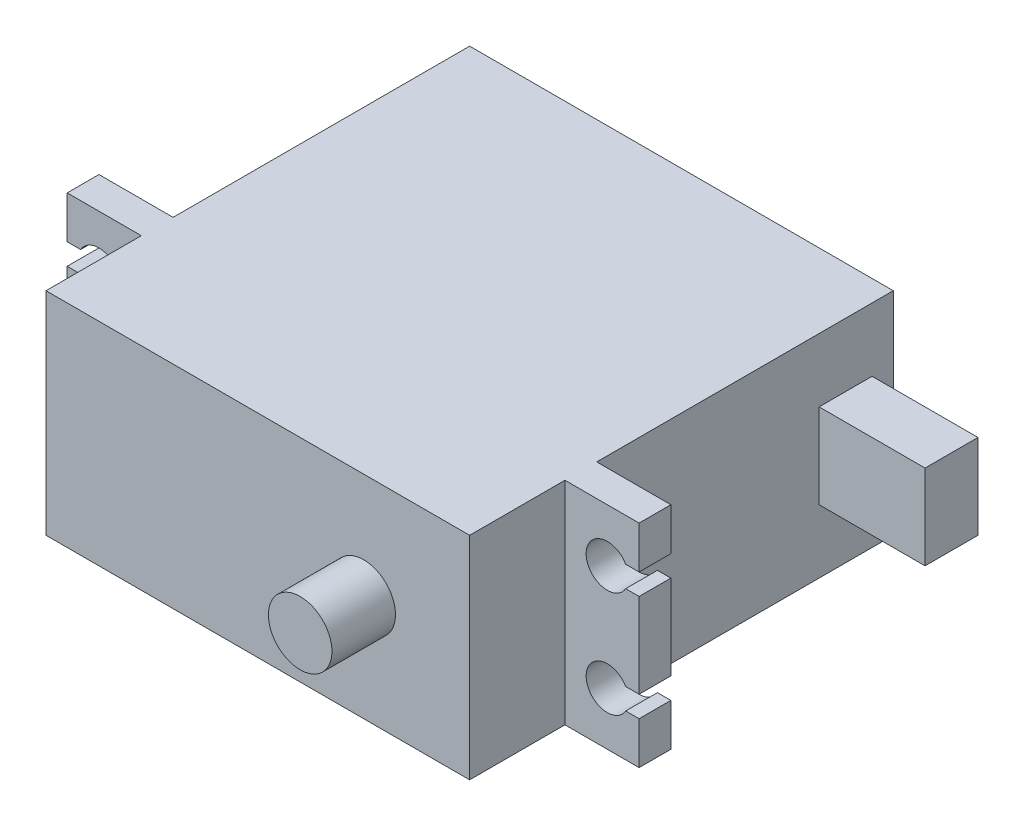
ISO-10303-21;
HEADER;
FILE_DESCRIPTION(('STEP AP214'),'2;1');
FILE_NAME('part.step','',(''),(''),'','','');
FILE_SCHEMA(('AUTOMOTIVE_DESIGN { 1 0 10303 214 1 1 1 1 }'));
ENDSEC;
DATA;
#1=APPLICATION_CONTEXT('core data for automotive mechanical design processes');
#2=APPLICATION_PROTOCOL_DEFINITION('international standard','automotive_design',2000,#1);
#3=PRODUCT_CONTEXT('',#1,'mechanical');
#4=PRODUCT('Part','Part','',(#3));
#5=PRODUCT_RELATED_PRODUCT_CATEGORY('part','',(#4));
#6=PRODUCT_DEFINITION_FORMATION('','',#4);
#7=PRODUCT_DEFINITION_CONTEXT('part definition',#1,'design');
#8=PRODUCT_DEFINITION('design','',#6,#7);
#9=PRODUCT_DEFINITION_SHAPE('','',#8);
#10=(LENGTH_UNIT() NAMED_UNIT(*) SI_UNIT(.MILLI.,.METRE.));
#11=(NAMED_UNIT(*) PLANE_ANGLE_UNIT() SI_UNIT($,.RADIAN.));
#12=(NAMED_UNIT(*) SI_UNIT($,.STERADIAN.) SOLID_ANGLE_UNIT());
#13=UNCERTAINTY_MEASURE_WITH_UNIT(LENGTH_MEASURE(1.E-05),#10,'distance_accuracy_value','');
#14=(GEOMETRIC_REPRESENTATION_CONTEXT(3) GLOBAL_UNCERTAINTY_ASSIGNED_CONTEXT((#13)) GLOBAL_UNIT_ASSIGNED_CONTEXT((#10,
#11,#12)) REPRESENTATION_CONTEXT('',''));
#15=CARTESIAN_POINT('',(0.,0.,0.));
#16=DIRECTION('',(0.,0.,1.));
#17=DIRECTION('',(1.,0.,0.));
#18=AXIS2_PLACEMENT_3D('',#15,#16,#17);
#19=CARTESIAN_POINT('',(10.,-10.,26.));
#20=DIRECTION('',(0.,0.,1.));
#21=DIRECTION('',(1.,0.,0.));
#22=AXIS2_PLACEMENT_3D('',#19,#20,#21);
#23=PLANE('',#22);
#24=CARTESIAN_POINT('',(10.,-10.,26.));
#25=DIRECTION('',(0.,0.,1.));
#26=DIRECTION('',(-1.,0.,0.));
#27=AXIS2_PLACEMENT_3D('',#24,#25,#26);
#28=CIRCLE('',#27,3.);
#29=CARTESIAN_POINT('',(7.,-10.,26.));
#30=VERTEX_POINT('',#29);
#31=EDGE_CURVE('E10',#30,#30,#28,.T.);
#32=ORIENTED_EDGE('',*,*,#31,.T.);
#33=EDGE_LOOP('',(#32));
#34=FACE_BOUND('',#33,.T.);
#35=ADVANCED_FACE('F16',(#34),#23,.T.);
#36=CARTESIAN_POINT('',(10.,-10.,20.));
#37=DIRECTION('',(0.,0.,-1.));
#38=DIRECTION('',(-1.,0.,0.));
#39=AXIS2_PLACEMENT_3D('',#36,#37,#38);
#40=CYLINDRICAL_SURFACE('',#39,3.);
#41=CARTESIAN_POINT('',(10.,-10.,20.));
#42=DIRECTION('',(0.,0.,1.));
#43=DIRECTION('',(-1.,0.,0.));
#44=AXIS2_PLACEMENT_3D('',#41,#42,#43);
#45=CIRCLE('',#44,3.);
#46=CARTESIAN_POINT('',(7.,-10.,20.));
#47=VERTEX_POINT('',#46);
#48=EDGE_CURVE('E494',#47,#47,#45,.T.);
#49=ORIENTED_EDGE('',*,*,#48,.T.);
#50=DIRECTION('',(0.,0.,1.));
#51=VECTOR('',#50,1.);
#52=CARTESIAN_POINT('',(7.,-10.,20.));
#53=LINE('',#52,#51);
#54=EDGE_CURVE('E24',#47,#30,#53,.T.);
#55=ORIENTED_EDGE('',*,*,#54,.T.);
#56=ORIENTED_EDGE('',*,*,#31,.F.);
#57=ORIENTED_EDGE('',*,*,#54,.F.);
#58=EDGE_LOOP('',(#49,#55,#56,#57));
#59=FACE_BOUND('',#58,.T.);
#60=ADVANCED_FACE('F775',(#59),#40,.T.);
#61=CARTESIAN_POINT('',(30.,-10.,-15.5));
#62=DIRECTION('',(1.,0.,0.));
#63=DIRECTION('',(0.,1.,0.));
#64=AXIS2_PLACEMENT_3D('',#61,#62,#63);
#65=PLANE('',#64);
#66=DIRECTION('',(0.,1.,0.));
#67=VECTOR('',#66,1.);
#68=CARTESIAN_POINT('',(30.,-14.,-18.));
#69=LINE('',#68,#67);
#70=CARTESIAN_POINT('',(30.,-14.,-18.));
#71=VERTEX_POINT('',#70);
#72=CARTESIAN_POINT('',(30.,-6.,-18.));
#73=VERTEX_POINT('',#72);
#74=EDGE_CURVE('E350',#71,#73,#69,.T.);
#75=ORIENTED_EDGE('',*,*,#74,.T.);
#76=DIRECTION('',(0.,0.,1.));
#77=VECTOR('',#76,1.);
#78=CARTESIAN_POINT('',(30.,-6.,-18.));
#79=LINE('',#78,#77);
#80=CARTESIAN_POINT('',(30.,-6.,-13.));
#81=VERTEX_POINT('',#80);
#82=EDGE_CURVE('E454',#73,#81,#79,.T.);
#83=ORIENTED_EDGE('',*,*,#82,.T.);
#84=DIRECTION('',(0.,-1.,0.));
#85=VECTOR('',#84,1.);
#86=CARTESIAN_POINT('',(30.,-6.,-13.));
#87=LINE('',#86,#85);
#88=CARTESIAN_POINT('',(30.,-14.,-13.));
#89=VERTEX_POINT('',#88);
#90=EDGE_CURVE('E445',#81,#89,#87,.T.);
#91=ORIENTED_EDGE('',*,*,#90,.T.);
#92=DIRECTION('',(0.,0.,-1.));
#93=VECTOR('',#92,1.);
#94=CARTESIAN_POINT('',(30.,-14.,-13.));
#95=LINE('',#94,#93);
#96=EDGE_CURVE('E265',#89,#71,#95,.T.);
#97=ORIENTED_EDGE('',*,*,#96,.T.);
#98=EDGE_LOOP('',(#75,#83,#91,#97));
#99=FACE_BOUND('',#98,.T.);
#100=ADVANCED_FACE('F776',(#99),#65,.T.);
#101=CARTESIAN_POINT('',(25.732050807624,-16.,81.815334497551));
#102=DIRECTION('',(0.,-1.,0.));
#103=DIRECTION('',(-1.,0.,0.));
#104=AXIS2_PLACEMENT_3D('',#101,#102,#103);
#105=PLANE('',#104);
#106=DIRECTION('',(0.,0.,-1.));
#107=VECTOR('',#106,1.);
#108=CARTESIAN_POINT('',(27.,-16.,81.815334497551));
#109=LINE('',#108,#107);
#110=CARTESIAN_POINT('',(27.,-16.,11.));
#111=VERTEX_POINT('',#110);
#112=CARTESIAN_POINT('',(27.,-16.,8.));
#113=VERTEX_POINT('',#112);
#114=EDGE_CURVE('E229',#111,#113,#109,.T.);
#115=ORIENTED_EDGE('',*,*,#114,.T.);
#116=DIRECTION('',(1.,0.,0.));
#117=VECTOR('',#116,1.);
#118=CARTESIAN_POINT('',(12.866025403812,-16.,8.));
#119=LINE('',#118,#117);
#120=CARTESIAN_POINT('',(25.732050807602,-15.99999999999,8.));
#121=VERTEX_POINT('',#120);
#122=EDGE_CURVE('E397',#121,#113,#119,.T.);
#123=ORIENTED_EDGE('',*,*,#122,.F.);
#124=DIRECTION('',(0.,0.,-1.));
#125=VECTOR('',#124,1.);
#126=CARTESIAN_POINT('',(25.732050807602,-15.99999999999,81.815334497551));
#127=LINE('',#126,#125);
#128=CARTESIAN_POINT('',(25.732050807602,-15.99999999999,11.));
#129=VERTEX_POINT('',#128);
#130=EDGE_CURVE('E379',#129,#121,#127,.T.);
#131=ORIENTED_EDGE('',*,*,#130,.F.);
#132=DIRECTION('',(1.,0.,0.));
#133=VECTOR('',#132,1.);
#134=CARTESIAN_POINT('',(12.866025403812,-16.,11.));
#135=LINE('',#134,#133);
#136=EDGE_CURVE('E510',#129,#111,#135,.T.);
#137=ORIENTED_EDGE('',*,*,#136,.T.);
#138=EDGE_LOOP('',(#115,#123,#131,#137));
#139=FACE_BOUND('',#138,.T.);
#140=ADVANCED_FACE('F525',(#139),#105,.F.);
#141=CARTESIAN_POINT('',(24.,-15.,81.815334497551));
#142=DIRECTION('',(0.,0.,1.));
#143=DIRECTION('',(-1.,0.,0.));
#144=AXIS2_PLACEMENT_3D('',#141,#142,#143);
#145=CYLINDRICAL_SURFACE('',#144,2.);
#146=ORIENTED_EDGE('',*,*,#130,.T.);
#147=CARTESIAN_POINT('',(24.,-15.,8.));
#148=DIRECTION('',(0.,0.,1.));
#149=DIRECTION('',(-1.,0.,0.));
#150=AXIS2_PLACEMENT_3D('',#147,#148,#149);
#151=CIRCLE('',#150,2.);
#152=CARTESIAN_POINT('',(25.732050807606,-14.00000000001,8.));
#153=VERTEX_POINT('',#152);
#154=EDGE_CURVE('E403',#153,#121,#151,.T.);
#155=ORIENTED_EDGE('',*,*,#154,.F.);
#156=DIRECTION('',(0.,0.,-1.));
#157=VECTOR('',#156,1.);
#158=CARTESIAN_POINT('',(25.732050807606,-14.00000000001,81.815334497551));
#159=LINE('',#158,#157);
#160=CARTESIAN_POINT('',(25.732050807606,-14.00000000001,11.));
#161=VERTEX_POINT('',#160);
#162=EDGE_CURVE('E383',#161,#153,#159,.T.);
#163=ORIENTED_EDGE('',*,*,#162,.F.);
#164=CARTESIAN_POINT('',(24.,-15.,11.));
#165=DIRECTION('',(0.,0.,1.));
#166=DIRECTION('',(-1.,0.,0.));
#167=AXIS2_PLACEMENT_3D('',#164,#165,#166);
#168=CIRCLE('',#167,2.);
#169=EDGE_CURVE('E285',#161,#129,#168,.T.);
#170=ORIENTED_EDGE('',*,*,#169,.T.);
#171=EDGE_LOOP('',(#146,#155,#163,#170));
#172=FACE_BOUND('',#171,.T.);
#173=ADVANCED_FACE('F516',(#172),#145,.F.);
#174=CARTESIAN_POINT('',(25.732050807626,-14.,81.815334497551));
#175=DIRECTION('',(8.62156E-12,-1.,0.));
#176=DIRECTION('',(0.,0.,-1.));
#177=AXIS2_PLACEMENT_3D('',#174,#175,#176);
#178=PLANE('',#177);
#179=DIRECTION('',(1.,8.62156E-12,0.));
#180=VECTOR('',#179,1.);
#181=CARTESIAN_POINT('',(12.86602540383,-14.00000000011,11.));
#182=LINE('',#181,#180);
#183=CARTESIAN_POINT('',(27.,-13.99999999999,11.));
#184=VERTEX_POINT('',#183);
#185=EDGE_CURVE('E217',#161,#184,#182,.T.);
#186=ORIENTED_EDGE('',*,*,#185,.F.);
#187=ORIENTED_EDGE('',*,*,#162,.T.);
#188=DIRECTION('',(1.,8.62156E-12,0.));
#189=VECTOR('',#188,1.);
#190=CARTESIAN_POINT('',(12.86602540383,-14.00000000011,8.));
#191=LINE('',#190,#189);
#192=CARTESIAN_POINT('',(27.,-13.99999999999,8.));
#193=VERTEX_POINT('',#192);
#194=EDGE_CURVE('E434',#153,#193,#191,.T.);
#195=ORIENTED_EDGE('',*,*,#194,.T.);
#196=DIRECTION('',(0.,0.,-1.));
#197=VECTOR('',#196,1.);
#198=CARTESIAN_POINT('',(27.,-13.99999999999,81.815334497551));
#199=LINE('',#198,#197);
#200=EDGE_CURVE('E384',#184,#193,#199,.T.);
#201=ORIENTED_EDGE('',*,*,#200,.F.);
#202=EDGE_LOOP('',(#186,#187,#195,#201));
#203=FACE_BOUND('',#202,.T.);
#204=ADVANCED_FACE('F828',(#203),#178,.T.);
#205=CARTESIAN_POINT('',(27.,-20.,8.));
#206=DIRECTION('',(-1.,0.,0.));
#207=DIRECTION('',(0.,0.,1.));
#208=AXIS2_PLACEMENT_3D('',#205,#206,#207);
#209=PLANE('',#208);
#210=DIRECTION('',(0.,0.,-1.));
#211=VECTOR('',#210,1.);
#212=CARTESIAN_POINT('',(27.,-6.000000000005,81.815334497551));
#213=LINE('',#212,#211);
#214=CARTESIAN_POINT('',(27.,-6.000000000005,11.));
#215=VERTEX_POINT('',#214);
#216=CARTESIAN_POINT('',(27.,-6.000000000005,8.));
#217=VERTEX_POINT('',#216);
#218=EDGE_CURVE('E200',#215,#217,#213,.T.);
#219=ORIENTED_EDGE('',*,*,#218,.F.);
#220=DIRECTION('',(0.,1.,0.));
#221=VECTOR('',#220,1.);
#222=CARTESIAN_POINT('',(27.,-20.,11.));
#223=LINE('',#222,#221);
#224=EDGE_CURVE('E213',#184,#215,#223,.T.);
#225=ORIENTED_EDGE('',*,*,#224,.F.);
#226=ORIENTED_EDGE('',*,*,#200,.T.);
#227=DIRECTION('',(0.,1.,0.));
#228=VECTOR('',#227,1.);
#229=CARTESIAN_POINT('',(27.,-20.,8.));
#230=LINE('',#229,#228);
#231=EDGE_CURVE('E431',#193,#217,#230,.T.);
#232=ORIENTED_EDGE('',*,*,#231,.T.);
#233=EDGE_LOOP('',(#219,#225,#226,#232));
#234=FACE_BOUND('',#233,.T.);
#235=ADVANCED_FACE('F834',(#234),#209,.F.);
#236=CARTESIAN_POINT('',(25.732050807626,-5.999999999994,81.815334497551));
#237=DIRECTION('',(-8.62016E-12,-1.,0.));
#238=DIRECTION('',(-1.,8.62016E-12,0.));
#239=AXIS2_PLACEMENT_3D('',#236,#237,#238);
#240=PLANE('',#239);
#241=ORIENTED_EDGE('',*,*,#218,.T.);
#242=DIRECTION('',(1.,-8.62016E-12,0.));
#243=VECTOR('',#242,1.);
#244=CARTESIAN_POINT('',(12.86602540383,-5.999999999883,8.));
#245=LINE('',#244,#243);
#246=CARTESIAN_POINT('',(25.732050807606,-5.999999999983,8.));
#247=VERTEX_POINT('',#246);
#248=EDGE_CURVE('E191',#247,#217,#245,.T.);
#249=ORIENTED_EDGE('',*,*,#248,.F.);
#250=DIRECTION('',(0.,0.,-1.));
#251=VECTOR('',#250,1.);
#252=CARTESIAN_POINT('',(25.732050807606,-5.999999999983,81.815334497551));
#253=LINE('',#252,#251);
#254=CARTESIAN_POINT('',(25.732050807606,-5.999999999983,11.));
#255=VERTEX_POINT('',#254);
#256=EDGE_CURVE('E190',#255,#247,#253,.T.);
#257=ORIENTED_EDGE('',*,*,#256,.F.);
#258=DIRECTION('',(1.,-8.62016E-12,0.));
#259=VECTOR('',#258,1.);
#260=CARTESIAN_POINT('',(12.86602540383,-5.999999999883,11.));
#261=LINE('',#260,#259);
#262=EDGE_CURVE('E192',#255,#215,#261,.T.);
#263=ORIENTED_EDGE('',*,*,#262,.T.);
#264=EDGE_LOOP('',(#241,#249,#257,#263));
#265=FACE_BOUND('',#264,.T.);
#266=ADVANCED_FACE('F188',(#265),#240,.F.);
#267=CARTESIAN_POINT('',(24.,-5.,81.815334497551));
#268=DIRECTION('',(0.,0.,1.));
#269=DIRECTION('',(-1.,0.,0.));
#270=AXIS2_PLACEMENT_3D('',#267,#268,#269);
#271=CYLINDRICAL_SURFACE('',#270,2.);
#272=ORIENTED_EDGE('',*,*,#256,.T.);
#273=CARTESIAN_POINT('',(24.,-5.,8.));
#274=DIRECTION('',(0.,0.,1.));
#275=DIRECTION('',(-1.,0.,0.));
#276=AXIS2_PLACEMENT_3D('',#273,#274,#275);
#277=CIRCLE('',#276,2.);
#278=CARTESIAN_POINT('',(25.732050807602,-4.000000000007,8.));
#279=VERTEX_POINT('',#278);
#280=EDGE_CURVE('E269',#279,#247,#277,.T.);
#281=ORIENTED_EDGE('',*,*,#280,.F.);
#282=DIRECTION('',(0.,0.,-1.));
#283=VECTOR('',#282,1.);
#284=CARTESIAN_POINT('',(25.732050807602,-4.000000000007,81.815334497551));
#285=LINE('',#284,#283);
#286=CARTESIAN_POINT('',(25.732050807602,-4.000000000007,11.));
#287=VERTEX_POINT('',#286);
#288=EDGE_CURVE('E199',#287,#279,#285,.T.);
#289=ORIENTED_EDGE('',*,*,#288,.F.);
#290=CARTESIAN_POINT('',(24.,-5.,11.));
#291=DIRECTION('',(0.,0.,1.));
#292=DIRECTION('',(-1.,0.,0.));
#293=AXIS2_PLACEMENT_3D('',#290,#291,#292);
#294=CIRCLE('',#293,2.);
#295=EDGE_CURVE('E205',#287,#255,#294,.T.);
#296=ORIENTED_EDGE('',*,*,#295,.T.);
#297=EDGE_LOOP('',(#272,#281,#289,#296));
#298=FACE_BOUND('',#297,.T.);
#299=ADVANCED_FACE('F201',(#298),#271,.F.);
#300=CARTESIAN_POINT('',(25.732050807624,-3.999999999994,81.815334497551));
#301=DIRECTION('',(0.,-1.,0.));
#302=DIRECTION('',(-1.,0.,0.));
#303=AXIS2_PLACEMENT_3D('',#300,#301,#302);
#304=PLANE('',#303);
#305=DIRECTION('',(1.,0.,0.));
#306=VECTOR('',#305,1.);
#307=CARTESIAN_POINT('',(12.866025403812,-3.999999999994,11.));
#308=LINE('',#307,#306);
#309=CARTESIAN_POINT('',(27.,-3.999999999994,11.));
#310=VERTEX_POINT('',#309);
#311=EDGE_CURVE('E210',#287,#310,#308,.T.);
#312=ORIENTED_EDGE('',*,*,#311,.F.);
#313=ORIENTED_EDGE('',*,*,#288,.T.);
#314=DIRECTION('',(1.,0.,0.));
#315=VECTOR('',#314,1.);
#316=CARTESIAN_POINT('',(12.866025403812,-3.999999999994,8.));
#317=LINE('',#316,#315);
#318=CARTESIAN_POINT('',(27.,-3.999999999994,8.));
#319=VERTEX_POINT('',#318);
#320=EDGE_CURVE('E272',#279,#319,#317,.T.);
#321=ORIENTED_EDGE('',*,*,#320,.T.);
#322=DIRECTION('',(0.,0.,-1.));
#323=VECTOR('',#322,1.);
#324=CARTESIAN_POINT('',(27.,-3.999999999994,81.815334497551));
#325=LINE('',#324,#323);
#326=EDGE_CURVE('E42',#310,#319,#325,.T.);
#327=ORIENTED_EDGE('',*,*,#326,.F.);
#328=EDGE_LOOP('',(#312,#313,#321,#327));
#329=FACE_BOUND('',#328,.T.);
#330=ADVANCED_FACE('F761',(#329),#304,.T.);
#331=CARTESIAN_POINT('',(-25.73205080762,-3.999999999994,81.815334497551));
#332=DIRECTION('',(0.,1.,0.));
#333=DIRECTION('',(1.,0.,0.));
#334=AXIS2_PLACEMENT_3D('',#331,#332,#333);
#335=PLANE('',#334);
#336=DIRECTION('',(0.,0.,-1.));
#337=VECTOR('',#336,1.);
#338=CARTESIAN_POINT('',(-27.,-3.999999999994,81.815334497551));
#339=LINE('',#338,#337);
#340=CARTESIAN_POINT('',(-27.,-3.999999999994,11.));
#341=VERTEX_POINT('',#340);
#342=CARTESIAN_POINT('',(-27.,-3.999999999994,8.));
#343=VERTEX_POINT('',#342);
#344=EDGE_CURVE('E295',#341,#343,#339,.T.);
#345=ORIENTED_EDGE('',*,*,#344,.T.);
#346=DIRECTION('',(-1.,0.,0.));
#347=VECTOR('',#346,1.);
#348=CARTESIAN_POINT('',(-12.86602540381,-3.999999999994,8.));
#349=LINE('',#348,#347);
#350=CARTESIAN_POINT('',(-25.7320508076,-4.000000000007,8.));
#351=VERTEX_POINT('',#350);
#352=EDGE_CURVE('E412',#351,#343,#349,.T.);
#353=ORIENTED_EDGE('',*,*,#352,.F.);
#354=DIRECTION('',(0.,0.,-1.));
#355=VECTOR('',#354,1.);
#356=CARTESIAN_POINT('',(-25.7320508076,-4.000000000007,81.815334497551));
#357=LINE('',#356,#355);
#358=CARTESIAN_POINT('',(-25.7320508076,-4.000000000007,11.));
#359=VERTEX_POINT('',#358);
#360=EDGE_CURVE('E245',#359,#351,#357,.T.);
#361=ORIENTED_EDGE('',*,*,#360,.F.);
#362=DIRECTION('',(-1.,0.,0.));
#363=VECTOR('',#362,1.);
#364=CARTESIAN_POINT('',(-12.86602540381,-3.999999999994,11.));
#365=LINE('',#364,#363);
#366=EDGE_CURVE('E473',#359,#341,#365,.T.);
#367=ORIENTED_EDGE('',*,*,#366,.T.);
#368=EDGE_LOOP('',(#345,#353,#361,#367));
#369=FACE_BOUND('',#368,.T.);
#370=ADVANCED_FACE('F757',(#369),#335,.F.);
#371=CARTESIAN_POINT('',(-24.,-5.,81.815334497551));
#372=DIRECTION('',(0.,0.,1.));
#373=DIRECTION('',(-1.,0.,0.));
#374=AXIS2_PLACEMENT_3D('',#371,#372,#373);
#375=CYLINDRICAL_SURFACE('',#374,2.);
#376=ORIENTED_EDGE('',*,*,#360,.T.);
#377=CARTESIAN_POINT('',(-24.,-5.,8.));
#378=DIRECTION('',(0.,0.,1.));
#379=DIRECTION('',(-1.,0.,0.));
#380=AXIS2_PLACEMENT_3D('',#377,#378,#379);
#381=CIRCLE('',#380,2.);
#382=CARTESIAN_POINT('',(-25.7320508076,-5.999999999983,8.));
#383=VERTEX_POINT('',#382);
#384=EDGE_CURVE('E410',#383,#351,#381,.T.);
#385=ORIENTED_EDGE('',*,*,#384,.F.);
#386=DIRECTION('',(0.,0.,-1.));
#387=VECTOR('',#386,1.);
#388=CARTESIAN_POINT('',(-25.7320508076,-5.999999999983,81.815334497551));
#389=LINE('',#388,#387);
#390=CARTESIAN_POINT('',(-25.7320508076,-5.999999999983,11.));
#391=VERTEX_POINT('',#390);
#392=EDGE_CURVE('E237',#391,#383,#389,.T.);
#393=ORIENTED_EDGE('',*,*,#392,.F.);
#394=CARTESIAN_POINT('',(-24.,-5.,11.));
#395=DIRECTION('',(0.,0.,1.));
#396=DIRECTION('',(-1.,0.,0.));
#397=AXIS2_PLACEMENT_3D('',#394,#395,#396);
#398=CIRCLE('',#397,2.);
#399=EDGE_CURVE('E475',#391,#359,#398,.T.);
#400=ORIENTED_EDGE('',*,*,#399,.T.);
#401=EDGE_LOOP('',(#376,#385,#393,#400));
#402=FACE_BOUND('',#401,.T.);
#403=ADVANCED_FACE('F751',(#402),#375,.F.);
#404=CARTESIAN_POINT('',(-25.73205080762,-5.999999999994,81.815334497551));
#405=DIRECTION('',(-8.62016E-12,1.,0.));
#406=DIRECTION('',(1.,8.62016E-12,0.));
#407=AXIS2_PLACEMENT_3D('',#404,#405,#406);
#408=PLANE('',#407);
#409=DIRECTION('',(-1.,-8.62016E-12,0.));
#410=VECTOR('',#409,1.);
#411=CARTESIAN_POINT('',(-12.86602540383,-5.999999999883,11.));
#412=LINE('',#411,#410);
#413=CARTESIAN_POINT('',(-27.,-6.000000000005,11.));
#414=VERTEX_POINT('',#413);
#415=EDGE_CURVE('E304',#391,#414,#412,.T.);
#416=ORIENTED_EDGE('',*,*,#415,.F.);
#417=ORIENTED_EDGE('',*,*,#392,.T.);
#418=DIRECTION('',(-1.,-8.62016E-12,0.));
#419=VECTOR('',#418,1.);
#420=CARTESIAN_POINT('',(-12.86602540383,-5.999999999883,8.));
#421=LINE('',#420,#419);
#422=CARTESIAN_POINT('',(-27.,-6.000000000005,8.));
#423=VERTEX_POINT('',#422);
#424=EDGE_CURVE('E398',#383,#423,#421,.T.);
#425=ORIENTED_EDGE('',*,*,#424,.T.);
#426=DIRECTION('',(0.,0.,-1.));
#427=VECTOR('',#426,1.);
#428=CARTESIAN_POINT('',(-27.,-6.000000000005,81.815334497551));
#429=LINE('',#428,#427);
#430=EDGE_CURVE('E240',#414,#423,#429,.T.);
#431=ORIENTED_EDGE('',*,*,#430,.F.);
#432=EDGE_LOOP('',(#416,#417,#425,#431));
#433=FACE_BOUND('',#432,.T.);
#434=ADVANCED_FACE('F755',(#433),#408,.T.);
#435=CARTESIAN_POINT('',(-27.,0.,8.));
#436=DIRECTION('',(1.,0.,0.));
#437=DIRECTION('',(0.,1.,0.));
#438=AXIS2_PLACEMENT_3D('',#435,#436,#437);
#439=PLANE('',#438);
#440=DIRECTION('',(0.,0.,-1.));
#441=VECTOR('',#440,1.);
#442=CARTESIAN_POINT('',(-27.,-13.99999999999,81.815334497551));
#443=LINE('',#442,#441);
#444=CARTESIAN_POINT('',(-27.,-13.99999999999,11.));
#445=VERTEX_POINT('',#444);
#446=CARTESIAN_POINT('',(-27.,-13.99999999999,8.));
#447=VERTEX_POINT('',#446);
#448=EDGE_CURVE('E239',#445,#447,#443,.T.);
#449=ORIENTED_EDGE('',*,*,#448,.F.);
#450=DIRECTION('',(0.,-1.,0.));
#451=VECTOR('',#450,1.);
#452=CARTESIAN_POINT('',(-27.,0.,11.));
#453=LINE('',#452,#451);
#454=EDGE_CURVE('E297',#414,#445,#453,.T.);
#455=ORIENTED_EDGE('',*,*,#454,.F.);
#456=ORIENTED_EDGE('',*,*,#430,.T.);
#457=DIRECTION('',(0.,-1.,0.));
#458=VECTOR('',#457,1.);
#459=CARTESIAN_POINT('',(-27.,0.,8.));
#460=LINE('',#459,#458);
#461=EDGE_CURVE('E391',#423,#447,#460,.T.);
#462=ORIENTED_EDGE('',*,*,#461,.T.);
#463=EDGE_LOOP('',(#449,#455,#456,#462));
#464=FACE_BOUND('',#463,.T.);
#465=ADVANCED_FACE('F750',(#464),#439,.F.);
#466=CARTESIAN_POINT('',(-25.73205080762,-14.,81.815334497551));
#467=DIRECTION('',(8.62156E-12,1.,0.));
#468=DIRECTION('',(1.,-8.62156E-12,0.));
#469=AXIS2_PLACEMENT_3D('',#466,#467,#468);
#470=PLANE('',#469);
#471=ORIENTED_EDGE('',*,*,#448,.T.);
#472=DIRECTION('',(-1.,8.62156E-12,0.));
#473=VECTOR('',#472,1.);
#474=CARTESIAN_POINT('',(-12.86602540383,-14.00000000011,8.));
#475=LINE('',#474,#473);
#476=CARTESIAN_POINT('',(-25.7320508076,-14.00000000001,8.));
#477=VERTEX_POINT('',#476);
#478=EDGE_CURVE('E377',#477,#447,#475,.T.);
#479=ORIENTED_EDGE('',*,*,#478,.F.);
#480=DIRECTION('',(0.,0.,-1.));
#481=VECTOR('',#480,1.);
#482=CARTESIAN_POINT('',(-25.7320508076,-14.00000000001,81.815334497551));
#483=LINE('',#482,#481);
#484=CARTESIAN_POINT('',(-25.7320508076,-14.00000000001,11.));
#485=VERTEX_POINT('',#484);
#486=EDGE_CURVE('E234',#485,#477,#483,.T.);
#487=ORIENTED_EDGE('',*,*,#486,.F.);
#488=DIRECTION('',(-1.,8.62156E-12,0.));
#489=VECTOR('',#488,1.);
#490=CARTESIAN_POINT('',(-12.86602540383,-14.00000000011,11.));
#491=LINE('',#490,#489);
#492=EDGE_CURVE('E305',#485,#445,#491,.T.);
#493=ORIENTED_EDGE('',*,*,#492,.T.);
#494=EDGE_LOOP('',(#471,#479,#487,#493));
#495=FACE_BOUND('',#494,.T.);
#496=ADVANCED_FACE('F743',(#495),#470,.F.);
#497=CARTESIAN_POINT('',(-24.,-15.,81.815334497551));
#498=DIRECTION('',(0.,0.,1.));
#499=DIRECTION('',(-1.,0.,0.));
#500=AXIS2_PLACEMENT_3D('',#497,#498,#499);
#501=CYLINDRICAL_SURFACE('',#500,2.);
#502=ORIENTED_EDGE('',*,*,#486,.T.);
#503=CARTESIAN_POINT('',(-24.,-15.,8.));
#504=DIRECTION('',(0.,0.,1.));
#505=DIRECTION('',(-1.,0.,0.));
#506=AXIS2_PLACEMENT_3D('',#503,#504,#505);
#507=CIRCLE('',#506,2.);
#508=CARTESIAN_POINT('',(-25.7320508076,-15.99999999999,8.));
#509=VERTEX_POINT('',#508);
#510=EDGE_CURVE('E374',#509,#477,#507,.T.);
#511=ORIENTED_EDGE('',*,*,#510,.F.);
#512=DIRECTION('',(0.,0.,-1.));
#513=VECTOR('',#512,1.);
#514=CARTESIAN_POINT('',(-25.7320508076,-15.99999999999,81.815334497551));
#515=LINE('',#514,#513);
#516=CARTESIAN_POINT('',(-25.7320508076,-15.99999999999,11.));
#517=VERTEX_POINT('',#516);
#518=EDGE_CURVE('E235',#517,#509,#515,.T.);
#519=ORIENTED_EDGE('',*,*,#518,.F.);
#520=CARTESIAN_POINT('',(-24.,-15.,11.));
#521=DIRECTION('',(0.,0.,1.));
#522=DIRECTION('',(-1.,0.,0.));
#523=AXIS2_PLACEMENT_3D('',#520,#521,#522);
#524=CIRCLE('',#523,2.);
#525=EDGE_CURVE('E483',#517,#485,#524,.T.);
#526=ORIENTED_EDGE('',*,*,#525,.T.);
#527=EDGE_LOOP('',(#502,#511,#519,#526));
#528=FACE_BOUND('',#527,.T.);
#529=ADVANCED_FACE('F739',(#528),#501,.F.);
#530=CARTESIAN_POINT('',(-25.73205080762,-16.,81.815334497551));
#531=DIRECTION('',(0.,1.,0.));
#532=DIRECTION('',(0.,0.,-1.));
#533=AXIS2_PLACEMENT_3D('',#530,#531,#532);
#534=PLANE('',#533);
#535=DIRECTION('',(-1.,0.,0.));
#536=VECTOR('',#535,1.);
#537=CARTESIAN_POINT('',(-12.86602540381,-16.,11.));
#538=LINE('',#537,#536);
#539=CARTESIAN_POINT('',(-27.,-16.,11.));
#540=VERTEX_POINT('',#539);
#541=EDGE_CURVE('E490',#517,#540,#538,.T.);
#542=ORIENTED_EDGE('',*,*,#541,.F.);
#543=ORIENTED_EDGE('',*,*,#518,.T.);
#544=DIRECTION('',(-1.,0.,0.));
#545=VECTOR('',#544,1.);
#546=CARTESIAN_POINT('',(-12.86602540381,-16.,8.));
#547=LINE('',#546,#545);
#548=CARTESIAN_POINT('',(-27.,-16.,8.));
#549=VERTEX_POINT('',#548);
#550=EDGE_CURVE('E371',#509,#549,#547,.T.);
#551=ORIENTED_EDGE('',*,*,#550,.T.);
#552=DIRECTION('',(0.,0.,-1.));
#553=VECTOR('',#552,1.);
#554=CARTESIAN_POINT('',(-27.,-16.,81.815334497551));
#555=LINE('',#554,#553);
#556=EDGE_CURVE('E231',#540,#549,#555,.T.);
#557=ORIENTED_EDGE('',*,*,#556,.F.);
#558=EDGE_LOOP('',(#542,#543,#551,#557));
#559=FACE_BOUND('',#558,.T.);
#560=ADVANCED_FACE('F736',(#559),#534,.T.);
#561=CARTESIAN_POINT('',(-27.,0.,8.));
#562=DIRECTION('',(1.,0.,0.));
#563=DIRECTION('',(0.,1.,0.));
#564=AXIS2_PLACEMENT_3D('',#561,#562,#563);
#565=PLANE('',#564);
#566=DIRECTION('',(0.,0.,1.));
#567=VECTOR('',#566,1.);
#568=CARTESIAN_POINT('',(-27.,-20.,8.));
#569=LINE('',#568,#567);
#570=CARTESIAN_POINT('',(-27.,-20.,8.));
#571=VERTEX_POINT('',#570);
#572=CARTESIAN_POINT('',(-27.,-20.,11.));
#573=VERTEX_POINT('',#572);
#574=EDGE_CURVE('E363',#571,#573,#569,.T.);
#575=ORIENTED_EDGE('',*,*,#574,.T.);
#576=DIRECTION('',(0.,-1.,0.));
#577=VECTOR('',#576,1.);
#578=CARTESIAN_POINT('',(-27.,0.,11.));
#579=LINE('',#578,#577);
#580=EDGE_CURVE('E289',#540,#573,#579,.T.);
#581=ORIENTED_EDGE('',*,*,#580,.F.);
#582=ORIENTED_EDGE('',*,*,#556,.T.);
#583=DIRECTION('',(0.,-1.,0.));
#584=VECTOR('',#583,1.);
#585=CARTESIAN_POINT('',(-27.,0.,8.));
#586=LINE('',#585,#584);
#587=EDGE_CURVE('E418',#549,#571,#586,.T.);
#588=ORIENTED_EDGE('',*,*,#587,.T.);
#589=EDGE_LOOP('',(#575,#581,#582,#588));
#590=FACE_BOUND('',#589,.T.);
#591=ADVANCED_FACE('F733',(#590),#565,.F.);
#592=CARTESIAN_POINT('',(27.,-20.,8.));
#593=DIRECTION('',(-1.,0.,0.));
#594=DIRECTION('',(0.,0.,1.));
#595=AXIS2_PLACEMENT_3D('',#592,#593,#594);
#596=PLANE('',#595);
#597=ORIENTED_EDGE('',*,*,#114,.F.);
#598=DIRECTION('',(0.,1.,0.));
#599=VECTOR('',#598,1.);
#600=CARTESIAN_POINT('',(27.,-20.,11.));
#601=LINE('',#600,#599);
#602=CARTESIAN_POINT('',(27.,-20.,11.));
#603=VERTEX_POINT('',#602);
#604=EDGE_CURVE('E504',#603,#111,#601,.T.);
#605=ORIENTED_EDGE('',*,*,#604,.F.);
#606=DIRECTION('',(0.,0.,1.));
#607=VECTOR('',#606,1.);
#608=CARTESIAN_POINT('',(27.,-20.,8.));
#609=LINE('',#608,#607);
#610=CARTESIAN_POINT('',(27.,-20.,8.));
#611=VERTEX_POINT('',#610);
#612=EDGE_CURVE('E334',#611,#603,#609,.T.);
#613=ORIENTED_EDGE('',*,*,#612,.F.);
#614=DIRECTION('',(0.,1.,0.));
#615=VECTOR('',#614,1.);
#616=CARTESIAN_POINT('',(27.,-20.,8.));
#617=LINE('',#616,#615);
#618=EDGE_CURVE('E263',#611,#113,#617,.T.);
#619=ORIENTED_EDGE('',*,*,#618,.T.);
#620=EDGE_LOOP('',(#597,#605,#613,#619));
#621=FACE_BOUND('',#620,.T.);
#622=ADVANCED_FACE('F685',(#621),#596,.F.);
#623=CARTESIAN_POINT('',(27.,-20.,8.));
#624=DIRECTION('',(-1.,0.,0.));
#625=DIRECTION('',(0.,0.,1.));
#626=AXIS2_PLACEMENT_3D('',#623,#624,#625);
#627=PLANE('',#626);
#628=DIRECTION('',(0.,0.,1.));
#629=VECTOR('',#628,1.);
#630=CARTESIAN_POINT('',(27.,0.,8.));
#631=LINE('',#630,#629);
#632=CARTESIAN_POINT('',(27.,0.,8.));
#633=VERTEX_POINT('',#632);
#634=CARTESIAN_POINT('',(27.,0.,11.));
#635=VERTEX_POINT('',#634);
#636=EDGE_CURVE('E317',#633,#635,#631,.T.);
#637=ORIENTED_EDGE('',*,*,#636,.T.);
#638=DIRECTION('',(0.,1.,0.));
#639=VECTOR('',#638,1.);
#640=CARTESIAN_POINT('',(27.,-20.,11.));
#641=LINE('',#640,#639);
#642=EDGE_CURVE('E221',#310,#635,#641,.T.);
#643=ORIENTED_EDGE('',*,*,#642,.F.);
#644=ORIENTED_EDGE('',*,*,#326,.T.);
#645=DIRECTION('',(0.,1.,0.));
#646=VECTOR('',#645,1.);
#647=CARTESIAN_POINT('',(27.,-20.,8.));
#648=LINE('',#647,#646);
#649=EDGE_CURVE('E420',#319,#633,#648,.T.);
#650=ORIENTED_EDGE('',*,*,#649,.T.);
#651=EDGE_LOOP('',(#637,#643,#644,#650));
#652=FACE_BOUND('',#651,.T.);
#653=ADVANCED_FACE('F826',(#652),#627,.F.);
#654=CARTESIAN_POINT('',(0.,-10.,11.));
#655=DIRECTION('',(0.,0.,1.));
#656=DIRECTION('',(1.,0.,0.));
#657=AXIS2_PLACEMENT_3D('',#654,#655,#656);
#658=PLANE('',#657);
#659=DIRECTION('',(0.,1.,0.));
#660=VECTOR('',#659,1.);
#661=CARTESIAN_POINT('',(20.,-5.,11.));
#662=LINE('',#661,#660);
#663=CARTESIAN_POINT('',(20.,-20.,11.));
#664=VERTEX_POINT('',#663);
#665=CARTESIAN_POINT('',(20.,0.,11.));
#666=VERTEX_POINT('',#665);
#667=EDGE_CURVE('E496',#664,#666,#662,.T.);
#668=ORIENTED_EDGE('',*,*,#667,.F.);
#669=DIRECTION('',(1.,0.,0.));
#670=VECTOR('',#669,1.);
#671=CARTESIAN_POINT('',(-27.,-20.,11.));
#672=LINE('',#671,#670);
#673=EDGE_CURVE('E337',#664,#603,#672,.T.);
#674=ORIENTED_EDGE('',*,*,#673,.T.);
#675=ORIENTED_EDGE('',*,*,#604,.T.);
#676=ORIENTED_EDGE('',*,*,#136,.F.);
#677=ORIENTED_EDGE('',*,*,#169,.F.);
#678=ORIENTED_EDGE('',*,*,#185,.T.);
#679=ORIENTED_EDGE('',*,*,#224,.T.);
#680=ORIENTED_EDGE('',*,*,#262,.F.);
#681=ORIENTED_EDGE('',*,*,#295,.F.);
#682=ORIENTED_EDGE('',*,*,#311,.T.);
#683=ORIENTED_EDGE('',*,*,#642,.T.);
#684=DIRECTION('',(-1.,0.,0.));
#685=VECTOR('',#684,1.);
#686=CARTESIAN_POINT('',(27.,0.,11.));
#687=LINE('',#686,#685);
#688=EDGE_CURVE('E312',#635,#666,#687,.T.);
#689=ORIENTED_EDGE('',*,*,#688,.T.);
#690=EDGE_LOOP('',(#668,#674,#675,#676,#677,#678,#679,#680,#681,#682,#683,#689));
#691=FACE_BOUND('',#690,.T.);
#692=ADVANCED_FACE('F209',(#691),#658,.T.);
#693=CARTESIAN_POINT('',(20.,0.,-20.));
#694=DIRECTION('',(-1.,0.,0.));
#695=DIRECTION('',(0.,0.,1.));
#696=AXIS2_PLACEMENT_3D('',#693,#694,#695);
#697=PLANE('',#696);
#698=DIRECTION('',(0.,-1.,0.));
#699=VECTOR('',#698,1.);
#700=CARTESIAN_POINT('',(20.,0.,20.));
#701=LINE('',#700,#699);
#702=CARTESIAN_POINT('',(20.,0.,20.));
#703=VERTEX_POINT('',#702);
#704=CARTESIAN_POINT('',(20.,-20.,20.));
#705=VERTEX_POINT('',#704);
#706=EDGE_CURVE('E491',#703,#705,#701,.T.);
#707=ORIENTED_EDGE('',*,*,#706,.T.);
#708=DIRECTION('',(0.,0.,1.));
#709=VECTOR('',#708,1.);
#710=CARTESIAN_POINT('',(20.,-20.,-20.));
#711=LINE('',#710,#709);
#712=EDGE_CURVE('E341',#664,#705,#711,.T.);
#713=ORIENTED_EDGE('',*,*,#712,.F.);
#714=ORIENTED_EDGE('',*,*,#667,.T.);
#715=DIRECTION('',(0.,0.,1.));
#716=VECTOR('',#715,1.);
#717=CARTESIAN_POINT('',(20.,0.,-20.));
#718=LINE('',#717,#716);
#719=EDGE_CURVE('E313',#666,#703,#718,.T.);
#720=ORIENTED_EDGE('',*,*,#719,.T.);
#721=EDGE_LOOP('',(#707,#713,#714,#720));
#722=FACE_BOUND('',#721,.T.);
#723=ADVANCED_FACE('F795',(#722),#697,.F.);
#724=CARTESIAN_POINT('',(20.,0.,20.));
#725=DIRECTION('',(0.,0.,-1.));
#726=DIRECTION('',(0.,-1.,0.));
#727=AXIS2_PLACEMENT_3D('',#724,#725,#726);
#728=PLANE('',#727);
#729=ORIENTED_EDGE('',*,*,#48,.F.);
#730=EDGE_LOOP('',(#729));
#731=FACE_BOUND('',#730,.T.);
#732=DIRECTION('',(-1.,0.,0.));
#733=VECTOR('',#732,1.);
#734=CARTESIAN_POINT('',(20.,0.,20.));
#735=LINE('',#734,#733);
#736=CARTESIAN_POINT('',(-20.,0.,20.));
#737=VERTEX_POINT('',#736);
#738=EDGE_CURVE('E307',#703,#737,#735,.T.);
#739=ORIENTED_EDGE('',*,*,#738,.T.);
#740=DIRECTION('',(0.,-1.,0.));
#741=VECTOR('',#740,1.);
#742=CARTESIAN_POINT('',(-20.,0.,20.));
#743=LINE('',#742,#741);
#744=CARTESIAN_POINT('',(-20.,-20.,20.));
#745=VERTEX_POINT('',#744);
#746=EDGE_CURVE('E488',#737,#745,#743,.T.);
#747=ORIENTED_EDGE('',*,*,#746,.T.);
#748=DIRECTION('',(-1.,0.,0.));
#749=VECTOR('',#748,1.);
#750=CARTESIAN_POINT('',(20.,-20.,20.));
#751=LINE('',#750,#749);
#752=EDGE_CURVE('E344',#705,#745,#751,.T.);
#753=ORIENTED_EDGE('',*,*,#752,.F.);
#754=ORIENTED_EDGE('',*,*,#706,.F.);
#755=EDGE_LOOP('',(#739,#747,#753,#754));
#756=FACE_BOUND('',#755,.T.);
#757=ADVANCED_FACE('F794',(#731,#756),#728,.F.);
#758=CARTESIAN_POINT('',(-20.,0.,20.));
#759=DIRECTION('',(1.,0.,0.));
#760=DIRECTION('',(0.,1.,0.));
#761=AXIS2_PLACEMENT_3D('',#758,#759,#760);
#762=PLANE('',#761);
#763=DIRECTION('',(0.,-1.,0.));
#764=VECTOR('',#763,1.);
#765=CARTESIAN_POINT('',(-20.,-5.,11.));
#766=LINE('',#765,#764);
#767=CARTESIAN_POINT('',(-20.,0.,11.));
#768=VERTEX_POINT('',#767);
#769=CARTESIAN_POINT('',(-20.,-20.,11.));
#770=VERTEX_POINT('',#769);
#771=EDGE_CURVE('E470',#768,#770,#766,.T.);
#772=ORIENTED_EDGE('',*,*,#771,.T.);
#773=DIRECTION('',(0.,0.,-1.));
#774=VECTOR('',#773,1.);
#775=CARTESIAN_POINT('',(-20.,-20.,20.));
#776=LINE('',#775,#774);
#777=EDGE_CURVE('E352',#745,#770,#776,.T.);
#778=ORIENTED_EDGE('',*,*,#777,.F.);
#779=ORIENTED_EDGE('',*,*,#746,.F.);
#780=DIRECTION('',(0.,0.,-1.));
#781=VECTOR('',#780,1.);
#782=CARTESIAN_POINT('',(-20.,0.,20.));
#783=LINE('',#782,#781);
#784=EDGE_CURVE('E296',#737,#768,#783,.T.);
#785=ORIENTED_EDGE('',*,*,#784,.T.);
#786=EDGE_LOOP('',(#772,#778,#779,#785));
#787=FACE_BOUND('',#786,.T.);
#788=ADVANCED_FACE('F803',(#787),#762,.F.);
#789=CARTESIAN_POINT('',(0.,-10.,11.));
#790=DIRECTION('',(0.,0.,1.));
#791=DIRECTION('',(1.,0.,0.));
#792=AXIS2_PLACEMENT_3D('',#789,#790,#791);
#793=PLANE('',#792);
#794=ORIENTED_EDGE('',*,*,#580,.T.);
#795=DIRECTION('',(1.,0.,0.));
#796=VECTOR('',#795,1.);
#797=CARTESIAN_POINT('',(-27.,-20.,11.));
#798=LINE('',#797,#796);
#799=EDGE_CURVE('E360',#573,#770,#798,.T.);
#800=ORIENTED_EDGE('',*,*,#799,.T.);
#801=ORIENTED_EDGE('',*,*,#771,.F.);
#802=DIRECTION('',(-1.,0.,0.));
#803=VECTOR('',#802,1.);
#804=CARTESIAN_POINT('',(27.,0.,11.));
#805=LINE('',#804,#803);
#806=CARTESIAN_POINT('',(-27.,0.,11.));
#807=VERTEX_POINT('',#806);
#808=EDGE_CURVE('E291',#768,#807,#805,.T.);
#809=ORIENTED_EDGE('',*,*,#808,.T.);
#810=DIRECTION('',(0.,-1.,0.));
#811=VECTOR('',#810,1.);
#812=CARTESIAN_POINT('',(-27.,0.,11.));
#813=LINE('',#812,#811);
#814=EDGE_CURVE('E286',#807,#341,#813,.T.);
#815=ORIENTED_EDGE('',*,*,#814,.T.);
#816=ORIENTED_EDGE('',*,*,#366,.F.);
#817=ORIENTED_EDGE('',*,*,#399,.F.);
#818=ORIENTED_EDGE('',*,*,#415,.T.);
#819=ORIENTED_EDGE('',*,*,#454,.T.);
#820=ORIENTED_EDGE('',*,*,#492,.F.);
#821=ORIENTED_EDGE('',*,*,#525,.F.);
#822=ORIENTED_EDGE('',*,*,#541,.T.);
#823=EDGE_LOOP('',(#794,#800,#801,#809,#815,#816,#817,#818,#819,#820,#821,#822));
#824=FACE_BOUND('',#823,.T.);
#825=ADVANCED_FACE('F760',(#824),#793,.T.);
#826=CARTESIAN_POINT('',(-27.,0.,8.));
#827=DIRECTION('',(1.,0.,0.));
#828=DIRECTION('',(0.,1.,0.));
#829=AXIS2_PLACEMENT_3D('',#826,#827,#828);
#830=PLANE('',#829);
#831=ORIENTED_EDGE('',*,*,#344,.F.);
#832=ORIENTED_EDGE('',*,*,#814,.F.);
#833=DIRECTION('',(0.,0.,1.));
#834=VECTOR('',#833,1.);
#835=CARTESIAN_POINT('',(-27.,0.,8.));
#836=LINE('',#835,#834);
#837=CARTESIAN_POINT('',(-27.,0.,8.));
#838=VERTEX_POINT('',#837);
#839=EDGE_CURVE('E300',#838,#807,#836,.T.);
#840=ORIENTED_EDGE('',*,*,#839,.F.);
#841=DIRECTION('',(0.,-1.,0.));
#842=VECTOR('',#841,1.);
#843=CARTESIAN_POINT('',(-27.,0.,8.));
#844=LINE('',#843,#842);
#845=EDGE_CURVE('E413',#838,#343,#844,.T.);
#846=ORIENTED_EDGE('',*,*,#845,.T.);
#847=EDGE_LOOP('',(#831,#832,#840,#846));
#848=FACE_BOUND('',#847,.T.);
#849=ADVANCED_FACE('F722',(#848),#830,.F.);
#850=CARTESIAN_POINT('',(20.,-14.,-18.));
#851=DIRECTION('',(0.,0.,1.));
#852=DIRECTION('',(1.,0.,0.));
#853=AXIS2_PLACEMENT_3D('',#850,#851,#852);
#854=PLANE('',#853);
#855=DIRECTION('',(0.,1.,0.));
#856=VECTOR('',#855,1.);
#857=CARTESIAN_POINT('',(20.,-14.,-18.));
#858=LINE('',#857,#856);
#859=CARTESIAN_POINT('',(20.,-14.,-18.));
#860=VERTEX_POINT('',#859);
#861=CARTESIAN_POINT('',(20.,-6.,-18.));
#862=VERTEX_POINT('',#861);
#863=EDGE_CURVE('E279',#860,#862,#858,.T.);
#864=ORIENTED_EDGE('',*,*,#863,.T.);
#865=DIRECTION('',(1.,0.,0.));
#866=VECTOR('',#865,1.);
#867=CARTESIAN_POINT('',(20.,-6.,-18.));
#868=LINE('',#867,#866);
#869=EDGE_CURVE('E347',#862,#73,#868,.T.);
#870=ORIENTED_EDGE('',*,*,#869,.T.);
#871=ORIENTED_EDGE('',*,*,#74,.F.);
#872=DIRECTION('',(1.,0.,0.));
#873=VECTOR('',#872,1.);
#874=CARTESIAN_POINT('',(20.,-14.,-18.));
#875=LINE('',#874,#873);
#876=EDGE_CURVE('E259',#860,#71,#875,.T.);
#877=ORIENTED_EDGE('',*,*,#876,.F.);
#878=EDGE_LOOP('',(#864,#870,#871,#877));
#879=FACE_BOUND('',#878,.T.);
#880=ADVANCED_FACE('F808',(#879),#854,.F.);
#881=CARTESIAN_POINT('',(20.,-6.,-18.));
#882=DIRECTION('',(0.,-1.,0.));
#883=DIRECTION('',(-1.,0.,0.));
#884=AXIS2_PLACEMENT_3D('',#881,#882,#883);
#885=PLANE('',#884);
#886=DIRECTION('',(0.,0.,1.));
#887=VECTOR('',#886,1.);
#888=CARTESIAN_POINT('',(20.,-6.,-18.));
#889=LINE('',#888,#887);
#890=CARTESIAN_POINT('',(20.,-6.,-13.));
#891=VERTEX_POINT('',#890);
#892=EDGE_CURVE('E273',#862,#891,#889,.T.);
#893=ORIENTED_EDGE('',*,*,#892,.T.);
#894=DIRECTION('',(1.,0.,0.));
#895=VECTOR('',#894,1.);
#896=CARTESIAN_POINT('',(20.,-6.,-13.));
#897=LINE('',#896,#895);
#898=EDGE_CURVE('E448',#891,#81,#897,.T.);
#899=ORIENTED_EDGE('',*,*,#898,.T.);
#900=ORIENTED_EDGE('',*,*,#82,.F.);
#901=ORIENTED_EDGE('',*,*,#869,.F.);
#902=EDGE_LOOP('',(#893,#899,#900,#901));
#903=FACE_BOUND('',#902,.T.);
#904=ADVANCED_FACE('F801',(#903),#885,.F.);
#905=CARTESIAN_POINT('',(20.,-6.,-13.));
#906=DIRECTION('',(0.,0.,-1.));
#907=DIRECTION('',(0.,-1.,0.));
#908=AXIS2_PLACEMENT_3D('',#905,#906,#907);
#909=PLANE('',#908);
#910=DIRECTION('',(0.,-1.,0.));
#911=VECTOR('',#910,1.);
#912=CARTESIAN_POINT('',(20.,-6.,-13.));
#913=LINE('',#912,#911);
#914=CARTESIAN_POINT('',(20.,-14.,-13.));
#915=VERTEX_POINT('',#914);
#916=EDGE_CURVE('E268',#891,#915,#913,.T.);
#917=ORIENTED_EDGE('',*,*,#916,.T.);
#918=DIRECTION('',(1.,0.,0.));
#919=VECTOR('',#918,1.);
#920=CARTESIAN_POINT('',(20.,-14.,-13.));
#921=LINE('',#920,#919);
#922=EDGE_CURVE('E428',#915,#89,#921,.T.);
#923=ORIENTED_EDGE('',*,*,#922,.T.);
#924=ORIENTED_EDGE('',*,*,#90,.F.);
#925=ORIENTED_EDGE('',*,*,#898,.F.);
#926=EDGE_LOOP('',(#917,#923,#924,#925));
#927=FACE_BOUND('',#926,.T.);
#928=ADVANCED_FACE('F804',(#927),#909,.F.);
#929=CARTESIAN_POINT('',(20.,-14.,-13.));
#930=DIRECTION('',(0.,1.,0.));
#931=DIRECTION('',(0.,0.,-1.));
#932=AXIS2_PLACEMENT_3D('',#929,#930,#931);
#933=PLANE('',#932);
#934=DIRECTION('',(0.,0.,-1.));
#935=VECTOR('',#934,1.);
#936=CARTESIAN_POINT('',(20.,-14.,-13.));
#937=LINE('',#936,#935);
#938=EDGE_CURVE('E282',#915,#860,#937,.T.);
#939=ORIENTED_EDGE('',*,*,#938,.T.);
#940=ORIENTED_EDGE('',*,*,#876,.T.);
#941=ORIENTED_EDGE('',*,*,#96,.F.);
#942=ORIENTED_EDGE('',*,*,#922,.F.);
#943=EDGE_LOOP('',(#939,#940,#941,#942));
#944=FACE_BOUND('',#943,.T.);
#945=ADVANCED_FACE('F816',(#944),#933,.F.);
#946=CARTESIAN_POINT('',(0.,-10.,8.));
#947=DIRECTION('',(0.,0.,1.));
#948=DIRECTION('',(1.,0.,0.));
#949=AXIS2_PLACEMENT_3D('',#946,#947,#948);
#950=PLANE('',#949);
#951=DIRECTION('',(-1.,0.,0.));
#952=VECTOR('',#951,1.);
#953=CARTESIAN_POINT('',(27.,0.,8.));
#954=LINE('',#953,#952);
#955=CARTESIAN_POINT('',(20.,0.,8.));
#956=VERTEX_POINT('',#955);
#957=EDGE_CURVE('E324',#633,#956,#954,.T.);
#958=ORIENTED_EDGE('',*,*,#957,.F.);
#959=ORIENTED_EDGE('',*,*,#649,.F.);
#960=ORIENTED_EDGE('',*,*,#320,.F.);
#961=ORIENTED_EDGE('',*,*,#280,.T.);
#962=ORIENTED_EDGE('',*,*,#248,.T.);
#963=ORIENTED_EDGE('',*,*,#231,.F.);
#964=ORIENTED_EDGE('',*,*,#194,.F.);
#965=ORIENTED_EDGE('',*,*,#154,.T.);
#966=ORIENTED_EDGE('',*,*,#122,.T.);
#967=ORIENTED_EDGE('',*,*,#618,.F.);
#968=DIRECTION('',(1.,0.,0.));
#969=VECTOR('',#968,1.);
#970=CARTESIAN_POINT('',(-27.,-20.,8.));
#971=LINE('',#970,#969);
#972=CARTESIAN_POINT('',(20.,-20.,8.));
#973=VERTEX_POINT('',#972);
#974=EDGE_CURVE('E327',#973,#611,#971,.T.);
#975=ORIENTED_EDGE('',*,*,#974,.F.);
#976=DIRECTION('',(0.,1.,0.));
#977=VECTOR('',#976,1.);
#978=CARTESIAN_POINT('',(20.,-5.,8.));
#979=LINE('',#978,#977);
#980=EDGE_CURVE('E260',#973,#956,#979,.T.);
#981=ORIENTED_EDGE('',*,*,#980,.T.);
#982=EDGE_LOOP('',(#958,#959,#960,#961,#962,#963,#964,#965,#966,#967,#975,#981));
#983=FACE_BOUND('',#982,.T.);
#984=ADVANCED_FACE('F530',(#983),#950,.F.);
#985=CARTESIAN_POINT('',(0.,-10.,8.));
#986=DIRECTION('',(0.,0.,1.));
#987=DIRECTION('',(1.,0.,0.));
#988=AXIS2_PLACEMENT_3D('',#985,#986,#987);
#989=PLANE('',#988);
#990=ORIENTED_EDGE('',*,*,#550,.F.);
#991=ORIENTED_EDGE('',*,*,#510,.T.);
#992=ORIENTED_EDGE('',*,*,#478,.T.);
#993=ORIENTED_EDGE('',*,*,#461,.F.);
#994=ORIENTED_EDGE('',*,*,#424,.F.);
#995=ORIENTED_EDGE('',*,*,#384,.T.);
#996=ORIENTED_EDGE('',*,*,#352,.T.);
#997=ORIENTED_EDGE('',*,*,#845,.F.);
#998=DIRECTION('',(-1.,0.,0.));
#999=VECTOR('',#998,1.);
#1000=CARTESIAN_POINT('',(27.,0.,8.));
#1001=LINE('',#1000,#999);
#1002=CARTESIAN_POINT('',(-20.,0.,8.));
#1003=VERTEX_POINT('',#1002);
#1004=EDGE_CURVE('E558',#1003,#838,#1001,.T.);
#1005=ORIENTED_EDGE('',*,*,#1004,.F.);
#1006=DIRECTION('',(0.,-1.,0.));
#1007=VECTOR('',#1006,1.);
#1008=CARTESIAN_POINT('',(-20.,-5.,8.));
#1009=LINE('',#1008,#1007);
#1010=CARTESIAN_POINT('',(-20.,-20.,8.));
#1011=VERTEX_POINT('',#1010);
#1012=EDGE_CURVE('E580',#1003,#1011,#1009,.T.);
#1013=ORIENTED_EDGE('',*,*,#1012,.T.);
#1014=DIRECTION('',(1.,0.,0.));
#1015=VECTOR('',#1014,1.);
#1016=CARTESIAN_POINT('',(-27.,-20.,8.));
#1017=LINE('',#1016,#1015);
#1018=EDGE_CURVE('E370',#571,#1011,#1017,.T.);
#1019=ORIENTED_EDGE('',*,*,#1018,.F.);
#1020=ORIENTED_EDGE('',*,*,#587,.F.);
#1021=EDGE_LOOP('',(#990,#991,#992,#993,#994,#995,#996,#997,#1005,#1013,#1019,#1020));
#1022=FACE_BOUND('',#1021,.T.);
#1023=ADVANCED_FACE('F716',(#1022),#989,.F.);
#1024=CARTESIAN_POINT('',(0.,-20.,1.414893617021));
#1025=DIRECTION('',(0.,-1.,0.));
#1026=DIRECTION('',(-1.,0.,0.));
#1027=AXIS2_PLACEMENT_3D('',#1024,#1025,#1026);
#1028=PLANE('',#1027);
#1029=DIRECTION('',(1.,0.,0.));
#1030=VECTOR('',#1029,1.);
#1031=CARTESIAN_POINT('',(-20.,-20.,-20.));
#1032=LINE('',#1031,#1030);
#1033=CARTESIAN_POINT('',(-20.,-20.,-20.));
#1034=VERTEX_POINT('',#1033);
#1035=CARTESIAN_POINT('',(20.,-20.,-20.));
#1036=VERTEX_POINT('',#1035);
#1037=EDGE_CURVE('E549',#1034,#1036,#1032,.T.);
#1038=ORIENTED_EDGE('',*,*,#1037,.T.);
#1039=DIRECTION('',(0.,0.,1.));
#1040=VECTOR('',#1039,1.);
#1041=CARTESIAN_POINT('',(20.,-20.,-20.));
#1042=LINE('',#1041,#1040);
#1043=EDGE_CURVE('E267',#1036,#973,#1042,.T.);
#1044=ORIENTED_EDGE('',*,*,#1043,.T.);
#1045=ORIENTED_EDGE('',*,*,#974,.T.);
#1046=ORIENTED_EDGE('',*,*,#612,.T.);
#1047=ORIENTED_EDGE('',*,*,#673,.F.);
#1048=ORIENTED_EDGE('',*,*,#712,.T.);
#1049=ORIENTED_EDGE('',*,*,#752,.T.);
#1050=ORIENTED_EDGE('',*,*,#777,.T.);
#1051=ORIENTED_EDGE('',*,*,#799,.F.);
#1052=ORIENTED_EDGE('',*,*,#574,.F.);
#1053=ORIENTED_EDGE('',*,*,#1018,.T.);
#1054=DIRECTION('',(0.,0.,-1.));
#1055=VECTOR('',#1054,1.);
#1056=CARTESIAN_POINT('',(-20.,-20.,20.));
#1057=LINE('',#1056,#1055);
#1058=EDGE_CURVE('E577',#1011,#1034,#1057,.T.);
#1059=ORIENTED_EDGE('',*,*,#1058,.T.);
#1060=EDGE_LOOP('',(#1038,#1044,#1045,#1046,#1047,#1048,#1049,#1050,#1051,#1052,#1053,#1059));
#1061=FACE_BOUND('',#1060,.T.);
#1062=ADVANCED_FACE('F687',(#1061),#1028,.T.);
#1063=CARTESIAN_POINT('',(0.,0.,1.414893617021));
#1064=DIRECTION('',(0.,1.,0.));
#1065=DIRECTION('',(0.,0.,-1.));
#1066=AXIS2_PLACEMENT_3D('',#1063,#1064,#1065);
#1067=PLANE('',#1066);
#1068=DIRECTION('',(1.,0.,0.));
#1069=VECTOR('',#1068,1.);
#1070=CARTESIAN_POINT('',(-20.,0.,-20.));
#1071=LINE('',#1070,#1069);
#1072=CARTESIAN_POINT('',(-20.,0.,-20.));
#1073=VERTEX_POINT('',#1072);
#1074=CARTESIAN_POINT('',(20.,0.,-20.));
#1075=VERTEX_POINT('',#1074);
#1076=EDGE_CURVE('E543',#1073,#1075,#1071,.T.);
#1077=ORIENTED_EDGE('',*,*,#1076,.F.);
#1078=DIRECTION('',(0.,0.,-1.));
#1079=VECTOR('',#1078,1.);
#1080=CARTESIAN_POINT('',(-20.,0.,20.));
#1081=LINE('',#1080,#1079);
#1082=EDGE_CURVE('E583',#1003,#1073,#1081,.T.);
#1083=ORIENTED_EDGE('',*,*,#1082,.F.);
#1084=ORIENTED_EDGE('',*,*,#1004,.T.);
#1085=ORIENTED_EDGE('',*,*,#839,.T.);
#1086=ORIENTED_EDGE('',*,*,#808,.F.);
#1087=ORIENTED_EDGE('',*,*,#784,.F.);
#1088=ORIENTED_EDGE('',*,*,#738,.F.);
#1089=ORIENTED_EDGE('',*,*,#719,.F.);
#1090=ORIENTED_EDGE('',*,*,#688,.F.);
#1091=ORIENTED_EDGE('',*,*,#636,.F.);
#1092=ORIENTED_EDGE('',*,*,#957,.T.);
#1093=DIRECTION('',(0.,0.,1.));
#1094=VECTOR('',#1093,1.);
#1095=CARTESIAN_POINT('',(20.,0.,-20.));
#1096=LINE('',#1095,#1094);
#1097=EDGE_CURVE('E262',#1075,#956,#1096,.T.);
#1098=ORIENTED_EDGE('',*,*,#1097,.F.);
#1099=EDGE_LOOP('',(#1077,#1083,#1084,#1085,#1086,#1087,#1088,#1089,#1090,#1091,#1092,#1098));
#1100=FACE_BOUND('',#1099,.T.);
#1101=ADVANCED_FACE('F723',(#1100),#1067,.T.);
#1102=CARTESIAN_POINT('',(20.,0.,-20.));
#1103=DIRECTION('',(-1.,0.,0.));
#1104=DIRECTION('',(0.,0.,1.));
#1105=AXIS2_PLACEMENT_3D('',#1102,#1103,#1104);
#1106=PLANE('',#1105);
#1107=ORIENTED_EDGE('',*,*,#916,.F.);
#1108=ORIENTED_EDGE('',*,*,#892,.F.);
#1109=ORIENTED_EDGE('',*,*,#863,.F.);
#1110=ORIENTED_EDGE('',*,*,#938,.F.);
#1111=EDGE_LOOP('',(#1107,#1108,#1109,#1110));
#1112=FACE_BOUND('',#1111,.T.);
#1113=ORIENTED_EDGE('',*,*,#980,.F.);
#1114=ORIENTED_EDGE('',*,*,#1043,.F.);
#1115=DIRECTION('',(0.,-1.,0.));
#1116=VECTOR('',#1115,1.);
#1117=CARTESIAN_POINT('',(20.,0.,-20.));
#1118=LINE('',#1117,#1116);
#1119=EDGE_CURVE('E546',#1075,#1036,#1118,.T.);
#1120=ORIENTED_EDGE('',*,*,#1119,.F.);
#1121=ORIENTED_EDGE('',*,*,#1097,.T.);
#1122=EDGE_LOOP('',(#1113,#1114,#1120,#1121));
#1123=FACE_BOUND('',#1122,.T.);
#1124=ADVANCED_FACE('F606',(#1112,#1123),#1106,.F.);
#1125=CARTESIAN_POINT('',(-20.,0.,20.));
#1126=DIRECTION('',(1.,0.,0.));
#1127=DIRECTION('',(0.,1.,0.));
#1128=AXIS2_PLACEMENT_3D('',#1125,#1126,#1127);
#1129=PLANE('',#1128);
#1130=DIRECTION('',(0.,-1.,0.));
#1131=VECTOR('',#1130,1.);
#1132=CARTESIAN_POINT('',(-20.,0.,-20.));
#1133=LINE('',#1132,#1131);
#1134=EDGE_CURVE('E570',#1073,#1034,#1133,.T.);
#1135=ORIENTED_EDGE('',*,*,#1134,.T.);
#1136=ORIENTED_EDGE('',*,*,#1058,.F.);
#1137=ORIENTED_EDGE('',*,*,#1012,.F.);
#1138=ORIENTED_EDGE('',*,*,#1082,.T.);
#1139=EDGE_LOOP('',(#1135,#1136,#1137,#1138));
#1140=FACE_BOUND('',#1139,.T.);
#1141=ADVANCED_FACE('F725',(#1140),#1129,.F.);
#1142=CARTESIAN_POINT('',(-20.,0.,-20.));
#1143=DIRECTION('',(0.,0.,1.));
#1144=DIRECTION('',(0.,-1.,0.));
#1145=AXIS2_PLACEMENT_3D('',#1142,#1143,#1144);
#1146=PLANE('',#1145);
#1147=ORIENTED_EDGE('',*,*,#1076,.T.);
#1148=ORIENTED_EDGE('',*,*,#1119,.T.);
#1149=ORIENTED_EDGE('',*,*,#1037,.F.);
#1150=ORIENTED_EDGE('',*,*,#1134,.F.);
#1151=EDGE_LOOP('',(#1147,#1148,#1149,#1150));
#1152=FACE_BOUND('',#1151,.T.);
#1153=ADVANCED_FACE('F694',(#1152),#1146,.F.);
#1154=CLOSED_SHELL('',(#35,#60,#100,#140,#173,#204,#235,#266,#299,#330,#370,#403,#434,#465,#496,
#529,#560,#591,#622,#653,#692,#723,#757,#788,#825,#849,#880,#904,#928,#945,#984,#1023,#1062,
#1101,#1124,#1141,#1153));
#1155=MANIFOLD_SOLID_BREP('B1',#1154);
#1156=ADVANCED_BREP_SHAPE_REPRESENTATION('',(#18,#1155),#14);
#1157=SHAPE_DEFINITION_REPRESENTATION(#9,#1156);
ENDSEC;
END-ISO-10303-21;
